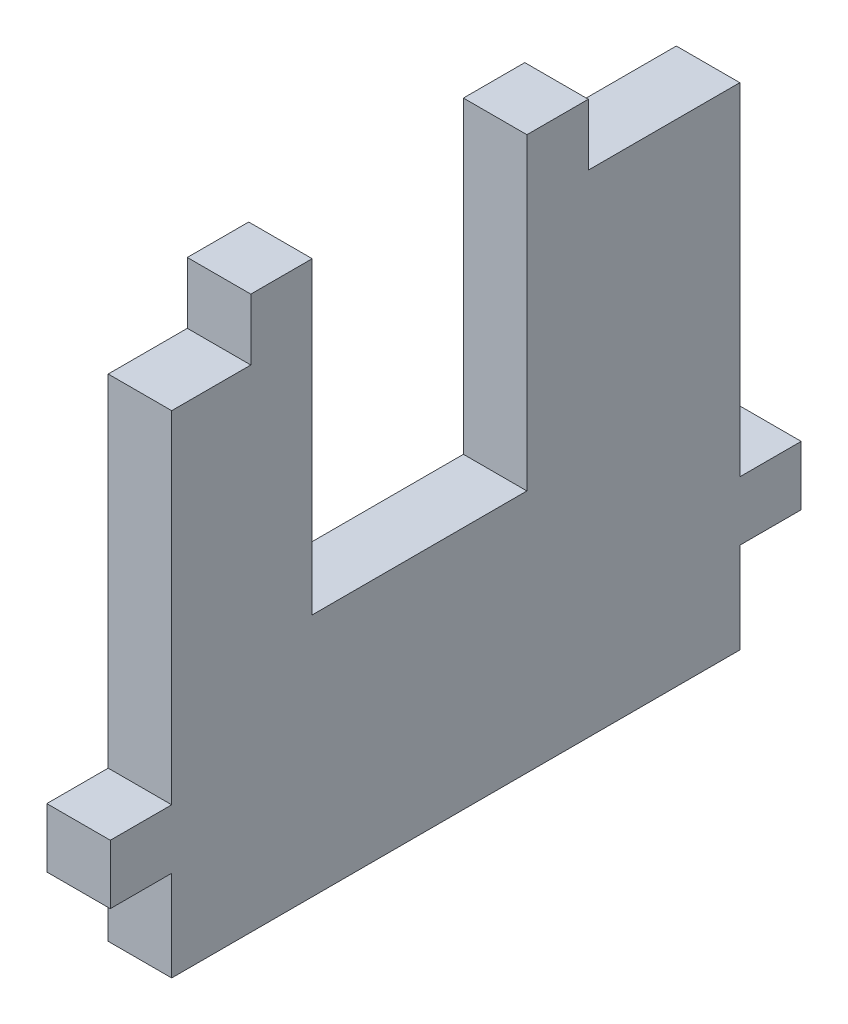
ISO-10303-21;
HEADER;
FILE_DESCRIPTION(('STEP AP214'),'2;1');
FILE_NAME('part.step','',(''),(''),'','','');
FILE_SCHEMA(('AUTOMOTIVE_DESIGN { 1 0 10303 214 1 1 1 1 }'));
ENDSEC;
DATA;
#1=APPLICATION_CONTEXT('core data for automotive mechanical design processes');
#2=APPLICATION_PROTOCOL_DEFINITION('international standard','automotive_design',2000,#1);
#3=PRODUCT_CONTEXT('',#1,'mechanical');
#4=PRODUCT('Part','Part','',(#3));
#5=PRODUCT_RELATED_PRODUCT_CATEGORY('part','',(#4));
#6=PRODUCT_DEFINITION_FORMATION('','',#4);
#7=PRODUCT_DEFINITION_CONTEXT('part definition',#1,'design');
#8=PRODUCT_DEFINITION('design','',#6,#7);
#9=PRODUCT_DEFINITION_SHAPE('','',#8);
#10=(LENGTH_UNIT() NAMED_UNIT(*) SI_UNIT(.MILLI.,.METRE.));
#11=(NAMED_UNIT(*) PLANE_ANGLE_UNIT() SI_UNIT($,.RADIAN.));
#12=(NAMED_UNIT(*) SI_UNIT($,.STERADIAN.) SOLID_ANGLE_UNIT());
#13=UNCERTAINTY_MEASURE_WITH_UNIT(LENGTH_MEASURE(1.E-05),#10,'distance_accuracy_value','');
#14=(GEOMETRIC_REPRESENTATION_CONTEXT(3) GLOBAL_UNCERTAINTY_ASSIGNED_CONTEXT((#13)) GLOBAL_UNIT_ASSIGNED_CONTEXT((#10,
#11,#12)) REPRESENTATION_CONTEXT('',''));
#15=CARTESIAN_POINT('',(0.,0.,0.));
#16=DIRECTION('',(0.,0.,1.));
#17=DIRECTION('',(1.,0.,0.));
#18=AXIS2_PLACEMENT_3D('',#15,#16,#17);
#19=CARTESIAN_POINT('',(-13.5209182106125,43.5041824122919,47.0580851754815));
#20=DIRECTION('',(0.,0.,1.));
#21=DIRECTION('',(1.,0.,0.));
#22=AXIS2_PLACEMENT_3D('',#19,#20,#21);
#23=PLANE('',#22);
#24=DIRECTION('',(1.,0.,0.));
#25=VECTOR('',#24,1.);
#26=CARTESIAN_POINT('',(-16.5209182106125,50.5903547962719,47.0580851754815));
#27=LINE('',#26,#25);
#28=CARTESIAN_POINT('',(-16.5209182106125,50.5903547962719,47.0580851754815));
#29=VERTEX_POINT('',#28);
#30=CARTESIAN_POINT('',(-13.5209182106125,50.5903547962719,47.0580851754815));
#31=VERTEX_POINT('',#30);
#32=EDGE_CURVE('E224',#29,#31,#27,.T.);
#33=ORIENTED_EDGE('',*,*,#32,.F.);
#34=DIRECTION('',(0.,1.,0.));
#35=VECTOR('',#34,1.);
#36=CARTESIAN_POINT('',(-16.5209182106125,43.5041824122919,47.0580851754815));
#37=LINE('',#36,#35);
#38=CARTESIAN_POINT('',(-16.5209182106125,66.7163547962719,47.0580851754815));
#39=VERTEX_POINT('',#38);
#40=EDGE_CURVE('E318',#29,#39,#37,.T.);
#41=ORIENTED_EDGE('',*,*,#40,.T.);
#42=DIRECTION('',(-1.,0.,0.));
#43=VECTOR('',#42,1.);
#44=CARTESIAN_POINT('',(-13.5209182106125,66.7163547962719,47.0580851754815));
#45=LINE('',#44,#43);
#46=CARTESIAN_POINT('',(-13.5209182106125,66.7163547962719,47.0580851754815));
#47=VERTEX_POINT('',#46);
#48=EDGE_CURVE('E302',#47,#39,#45,.T.);
#49=ORIENTED_EDGE('',*,*,#48,.F.);
#50=DIRECTION('',(0.,1.,0.));
#51=VECTOR('',#50,1.);
#52=CARTESIAN_POINT('',(-13.5209182106125,43.5041824122919,47.0580851754815));
#53=LINE('',#52,#51);
#54=EDGE_CURVE('E262',#31,#47,#53,.T.);
#55=ORIENTED_EDGE('',*,*,#54,.F.);
#56=EDGE_LOOP('',(#33,#41,#49,#55));
#57=FACE_BOUND('',#56,.T.);
#58=ADVANCED_FACE('F32',(#57),#23,.F.);
#59=CARTESIAN_POINT('',(-13.5209182106125,66.7163547962719,73.8980851754815));
#60=DIRECTION('',(0.,0.,-1.));
#61=DIRECTION('',(-1.,0.,0.));
#62=AXIS2_PLACEMENT_3D('',#59,#60,#61);
#63=PLANE('',#62);
#64=DIRECTION('',(1.,0.,0.));
#65=VECTOR('',#64,1.);
#66=CARTESIAN_POINT('',(-16.5209182106125,47.790354796272,73.8980851754815));
#67=LINE('',#66,#65);
#68=CARTESIAN_POINT('',(-16.5209182106125,47.790354796272,73.8980851754815));
#69=VERTEX_POINT('',#68);
#70=CARTESIAN_POINT('',(-13.5209182106125,47.790354796272,73.8980851754815));
#71=VERTEX_POINT('',#70);
#72=EDGE_CURVE('E335',#69,#71,#67,.T.);
#73=ORIENTED_EDGE('',*,*,#72,.F.);
#74=DIRECTION('',(0.,-1.,0.));
#75=VECTOR('',#74,1.);
#76=CARTESIAN_POINT('',(-16.5209182106125,66.7163547962719,73.8980851754815));
#77=LINE('',#76,#75);
#78=CARTESIAN_POINT('',(-16.5209182106125,43.5041824122919,73.8980851754815));
#79=VERTEX_POINT('',#78);
#80=EDGE_CURVE('E284',#69,#79,#77,.T.);
#81=ORIENTED_EDGE('',*,*,#80,.T.);
#82=DIRECTION('',(-1.,0.,0.));
#83=VECTOR('',#82,1.);
#84=CARTESIAN_POINT('',(-13.5209182106125,43.5041824122919,73.8980851754815));
#85=LINE('',#84,#83);
#86=CARTESIAN_POINT('',(-13.5209182106125,43.5041824122919,73.8980851754815));
#87=VERTEX_POINT('',#86);
#88=EDGE_CURVE('E41',#87,#79,#85,.T.);
#89=ORIENTED_EDGE('',*,*,#88,.F.);
#90=DIRECTION('',(0.,-1.,0.));
#91=VECTOR('',#90,1.);
#92=CARTESIAN_POINT('',(-13.5209182106125,66.7163547962719,73.8980851754815));
#93=LINE('',#92,#91);
#94=EDGE_CURVE('E348',#71,#87,#93,.T.);
#95=ORIENTED_EDGE('',*,*,#94,.F.);
#96=EDGE_LOOP('',(#73,#81,#89,#95));
#97=FACE_BOUND('',#96,.T.);
#98=ADVANCED_FACE('F366',(#97),#63,.F.);
#99=CARTESIAN_POINT('',(-13.5209182106125,66.7163547962719,73.8980851754815));
#100=DIRECTION('',(0.,-1.,0.));
#101=DIRECTION('',(1.,0.,0.));
#102=AXIS2_PLACEMENT_3D('',#99,#100,#101);
#103=PLANE('',#102);
#104=DIRECTION('',(0.,0.,1.));
#105=VECTOR('',#104,1.);
#106=CARTESIAN_POINT('',(-13.5209182106125,66.7163547962719,73.8980851754815));
#107=LINE('',#106,#105);
#108=CARTESIAN_POINT('',(-13.5209182106125,66.7163547962719,70.1600851754816));
#109=VERTEX_POINT('',#108);
#110=CARTESIAN_POINT('',(-13.5209182106125,66.7163547962719,73.8980851754815));
#111=VERTEX_POINT('',#110);
#112=EDGE_CURVE('E311',#109,#111,#107,.T.);
#113=ORIENTED_EDGE('',*,*,#112,.F.);
#114=DIRECTION('',(1.,0.,0.));
#115=VECTOR('',#114,1.);
#116=CARTESIAN_POINT('',(-16.5209182106125,66.7163547962719,70.1600851754816));
#117=LINE('',#116,#115);
#118=CARTESIAN_POINT('',(-16.5209182106125,66.7163547962719,70.1600851754816));
#119=VERTEX_POINT('',#118);
#120=EDGE_CURVE('E213',#119,#109,#117,.T.);
#121=ORIENTED_EDGE('',*,*,#120,.F.);
#122=DIRECTION('',(0.,0.,1.));
#123=VECTOR('',#122,1.);
#124=CARTESIAN_POINT('',(-16.5209182106125,66.7163547962719,73.8980851754815));
#125=LINE('',#124,#123);
#126=CARTESIAN_POINT('',(-16.5209182106125,66.7163547962719,73.8980851754815));
#127=VERTEX_POINT('',#126);
#128=EDGE_CURVE('E282',#119,#127,#125,.T.);
#129=ORIENTED_EDGE('',*,*,#128,.T.);
#130=DIRECTION('',(-1.,0.,0.));
#131=VECTOR('',#130,1.);
#132=CARTESIAN_POINT('',(-13.5209182106125,66.7163547962719,73.8980851754815));
#133=LINE('',#132,#131);
#134=EDGE_CURVE('E11',#111,#127,#133,.T.);
#135=ORIENTED_EDGE('',*,*,#134,.F.);
#136=EDGE_LOOP('',(#113,#121,#129,#135));
#137=FACE_BOUND('',#136,.T.);
#138=ADVANCED_FACE('F34',(#137),#103,.F.);
#139=CARTESIAN_POINT('',(-16.5209182106125,50.5903547962719,73.8980851754815));
#140=VERTEX_POINT('',#139);
#141=EDGE_CURVE('E294',#127,#140,#77,.T.);
#142=ORIENTED_EDGE('',*,*,#141,.T.);
#143=DIRECTION('',(1.,0.,0.));
#144=VECTOR('',#143,1.);
#145=CARTESIAN_POINT('',(-16.5209182106125,50.5903547962719,73.8980851754815));
#146=LINE('',#145,#144);
#147=CARTESIAN_POINT('',(-13.5209182106125,50.5903547962719,73.8980851754815));
#148=VERTEX_POINT('',#147);
#149=EDGE_CURVE('E285',#140,#148,#146,.T.);
#150=ORIENTED_EDGE('',*,*,#149,.T.);
#151=EDGE_CURVE('E353',#111,#148,#93,.T.);
#152=ORIENTED_EDGE('',*,*,#151,.F.);
#153=ORIENTED_EDGE('',*,*,#134,.T.);
#154=EDGE_LOOP('',(#142,#150,#152,#153));
#155=FACE_BOUND('',#154,.T.);
#156=ADVANCED_FACE('F404',(#155),#63,.F.);
#157=CARTESIAN_POINT('',(-13.5209182106125,43.5041824122919,47.0580851754815));
#158=DIRECTION('',(0.,1.,0.));
#159=DIRECTION('',(-1.,0.,0.));
#160=AXIS2_PLACEMENT_3D('',#157,#158,#159);
#161=PLANE('',#160);
#162=DIRECTION('',(0.,0.,-1.));
#163=VECTOR('',#162,1.);
#164=CARTESIAN_POINT('',(-16.5209182106125,43.5041824122919,47.0580851754815));
#165=LINE('',#164,#163);
#166=CARTESIAN_POINT('',(-16.5209182106125,43.5041824122919,47.0580851754815));
#167=VERTEX_POINT('',#166);
#168=EDGE_CURVE('E288',#79,#167,#165,.T.);
#169=ORIENTED_EDGE('',*,*,#168,.T.);
#170=DIRECTION('',(-1.,0.,0.));
#171=VECTOR('',#170,1.);
#172=CARTESIAN_POINT('',(-13.5209182106125,43.5041824122919,47.0580851754815));
#173=LINE('',#172,#171);
#174=CARTESIAN_POINT('',(-13.5209182106125,43.5041824122919,47.0580851754815));
#175=VERTEX_POINT('',#174);
#176=EDGE_CURVE('E299',#175,#167,#173,.T.);
#177=ORIENTED_EDGE('',*,*,#176,.F.);
#178=DIRECTION('',(0.,0.,-1.));
#179=VECTOR('',#178,1.);
#180=CARTESIAN_POINT('',(-13.5209182106125,43.5041824122919,47.0580851754815));
#181=LINE('',#180,#179);
#182=EDGE_CURVE('E266',#87,#175,#181,.T.);
#183=ORIENTED_EDGE('',*,*,#182,.F.);
#184=ORIENTED_EDGE('',*,*,#88,.T.);
#185=EDGE_LOOP('',(#169,#177,#183,#184));
#186=FACE_BOUND('',#185,.T.);
#187=ADVANCED_FACE('F370',(#186),#161,.F.);
#188=CARTESIAN_POINT('',(-16.5209182106125,47.790354796272,47.0580851754815));
#189=VERTEX_POINT('',#188);
#190=EDGE_CURVE('E315',#167,#189,#37,.T.);
#191=ORIENTED_EDGE('',*,*,#190,.T.);
#192=DIRECTION('',(1.,0.,0.));
#193=VECTOR('',#192,1.);
#194=CARTESIAN_POINT('',(-16.5209182106125,47.790354796272,47.0580851754815));
#195=LINE('',#194,#193);
#196=CARTESIAN_POINT('',(-13.5209182106125,47.790354796272,47.0580851754815));
#197=VERTEX_POINT('',#196);
#198=EDGE_CURVE('E236',#189,#197,#195,.T.);
#199=ORIENTED_EDGE('',*,*,#198,.T.);
#200=EDGE_CURVE('E265',#175,#197,#53,.T.);
#201=ORIENTED_EDGE('',*,*,#200,.F.);
#202=ORIENTED_EDGE('',*,*,#176,.T.);
#203=EDGE_LOOP('',(#191,#199,#201,#202));
#204=FACE_BOUND('',#203,.T.);
#205=ADVANCED_FACE('F374',(#204),#23,.F.);
#206=CARTESIAN_POINT('',(-13.5209182106125,66.7163547962719,57.1160851754815));
#207=DIRECTION('',(0.,-1.,0.));
#208=DIRECTION('',(1.,0.,0.));
#209=AXIS2_PLACEMENT_3D('',#206,#207,#208);
#210=PLANE('',#209);
#211=DIRECTION('',(0.,0.,1.));
#212=VECTOR('',#211,1.);
#213=CARTESIAN_POINT('',(-16.5209182106125,66.7163547962719,57.1160851754815));
#214=LINE('',#213,#212);
#215=CARTESIAN_POINT('',(-16.5209182106125,66.7163547962719,54.2160851754815));
#216=VERTEX_POINT('',#215);
#217=EDGE_CURVE('E54',#39,#216,#214,.T.);
#218=ORIENTED_EDGE('',*,*,#217,.T.);
#219=DIRECTION('',(1.,0.,0.));
#220=VECTOR('',#219,1.);
#221=CARTESIAN_POINT('',(-16.5209182106125,66.716354796272,54.2160851754815));
#222=LINE('',#221,#220);
#223=CARTESIAN_POINT('',(-13.5209182106125,66.7163547962719,54.2160851754815));
#224=VERTEX_POINT('',#223);
#225=EDGE_CURVE('E49',#216,#224,#222,.T.);
#226=ORIENTED_EDGE('',*,*,#225,.T.);
#227=DIRECTION('',(0.,0.,1.));
#228=VECTOR('',#227,1.);
#229=CARTESIAN_POINT('',(-13.5209182106125,66.7163547962719,57.1160851754815));
#230=LINE('',#229,#228);
#231=EDGE_CURVE('E272',#47,#224,#230,.T.);
#232=ORIENTED_EDGE('',*,*,#231,.F.);
#233=ORIENTED_EDGE('',*,*,#48,.T.);
#234=EDGE_LOOP('',(#218,#226,#232,#233));
#235=FACE_BOUND('',#234,.T.);
#236=ADVANCED_FACE('F388',(#235),#210,.F.);
#237=CARTESIAN_POINT('',(-13.5209182106125,55.0403547962719,57.1160851754815));
#238=DIRECTION('',(0.,0.,-1.));
#239=DIRECTION('',(-1.,0.,0.));
#240=AXIS2_PLACEMENT_3D('',#237,#238,#239);
#241=PLANE('',#240);
#242=DIRECTION('',(0.,-1.,0.));
#243=VECTOR('',#242,1.);
#244=CARTESIAN_POINT('',(-16.5209182106125,55.0403547962719,57.1160851754815));
#245=LINE('',#244,#243);
#246=CARTESIAN_POINT('',(-16.5209182106125,69.616354796272,57.1160851754815));
#247=VERTEX_POINT('',#246);
#248=CARTESIAN_POINT('',(-16.5209182106125,55.0403547962719,57.1160851754815));
#249=VERTEX_POINT('',#248);
#250=EDGE_CURVE('E191',#247,#249,#245,.T.);
#251=ORIENTED_EDGE('',*,*,#250,.T.);
#252=DIRECTION('',(-1.,0.,0.));
#253=VECTOR('',#252,1.);
#254=CARTESIAN_POINT('',(-13.5209182106125,55.0403547962719,57.1160851754815));
#255=LINE('',#254,#253);
#256=CARTESIAN_POINT('',(-13.5209182106125,55.0403547962719,57.1160851754815));
#257=VERTEX_POINT('',#256);
#258=EDGE_CURVE('E304',#257,#249,#255,.T.);
#259=ORIENTED_EDGE('',*,*,#258,.F.);
#260=DIRECTION('',(0.,-1.,0.));
#261=VECTOR('',#260,1.);
#262=CARTESIAN_POINT('',(-13.5209182106125,55.0403547962719,57.1160851754815));
#263=LINE('',#262,#261);
#264=CARTESIAN_POINT('',(-13.5209182106125,69.616354796272,57.1160851754815));
#265=VERTEX_POINT('',#264);
#266=EDGE_CURVE('E275',#265,#257,#263,.T.);
#267=ORIENTED_EDGE('',*,*,#266,.F.);
#268=DIRECTION('',(1.,0.,0.));
#269=VECTOR('',#268,1.);
#270=CARTESIAN_POINT('',(-16.5209182106125,69.616354796272,57.1160851754815));
#271=LINE('',#270,#269);
#272=EDGE_CURVE('E182',#247,#265,#271,.T.);
#273=ORIENTED_EDGE('',*,*,#272,.F.);
#274=EDGE_LOOP('',(#251,#259,#267,#273));
#275=FACE_BOUND('',#274,.T.);
#276=ADVANCED_FACE('F390',(#275),#241,.F.);
#277=CARTESIAN_POINT('',(-13.5209182106125,55.0403547962719,67.2600851754816));
#278=DIRECTION('',(0.,-1.,0.));
#279=DIRECTION('',(1.,0.,0.));
#280=AXIS2_PLACEMENT_3D('',#277,#278,#279);
#281=PLANE('',#280);
#282=DIRECTION('',(0.,0.,1.));
#283=VECTOR('',#282,1.);
#284=CARTESIAN_POINT('',(-16.5209182106125,55.0403547962719,67.2600851754816));
#285=LINE('',#284,#283);
#286=CARTESIAN_POINT('',(-16.5209182106125,55.0403547962719,67.2600851754816));
#287=VERTEX_POINT('',#286);
#288=EDGE_CURVE('E312',#249,#287,#285,.T.);
#289=ORIENTED_EDGE('',*,*,#288,.T.);
#290=DIRECTION('',(-1.,0.,0.));
#291=VECTOR('',#290,1.);
#292=CARTESIAN_POINT('',(-13.5209182106125,55.0403547962719,67.2600851754816));
#293=LINE('',#292,#291);
#294=CARTESIAN_POINT('',(-13.5209182106125,55.0403547962719,67.2600851754816));
#295=VERTEX_POINT('',#294);
#296=EDGE_CURVE('E281',#295,#287,#293,.T.);
#297=ORIENTED_EDGE('',*,*,#296,.F.);
#298=DIRECTION('',(0.,0.,1.));
#299=VECTOR('',#298,1.);
#300=CARTESIAN_POINT('',(-13.5209182106125,55.0403547962719,67.2600851754816));
#301=LINE('',#300,#299);
#302=EDGE_CURVE('E277',#257,#295,#301,.T.);
#303=ORIENTED_EDGE('',*,*,#302,.F.);
#304=ORIENTED_EDGE('',*,*,#258,.T.);
#305=EDGE_LOOP('',(#289,#297,#303,#304));
#306=FACE_BOUND('',#305,.T.);
#307=ADVANCED_FACE('F396',(#306),#281,.F.);
#308=CARTESIAN_POINT('',(-13.5209182106125,66.7163547962719,67.2600851754816));
#309=DIRECTION('',(0.,0.,1.));
#310=DIRECTION('',(1.,0.,0.));
#311=AXIS2_PLACEMENT_3D('',#308,#309,#310);
#312=PLANE('',#311);
#313=DIRECTION('',(0.,1.,0.));
#314=VECTOR('',#313,1.);
#315=CARTESIAN_POINT('',(-16.5209182106125,66.7163547962719,67.2600851754816));
#316=LINE('',#315,#314);
#317=CARTESIAN_POINT('',(-16.5209182106125,69.616354796272,67.2600851754816));
#318=VERTEX_POINT('',#317);
#319=EDGE_CURVE('E309',#287,#318,#316,.T.);
#320=ORIENTED_EDGE('',*,*,#319,.T.);
#321=DIRECTION('',(1.,0.,0.));
#322=VECTOR('',#321,1.);
#323=CARTESIAN_POINT('',(-16.5209182106125,69.616354796272,67.2600851754816));
#324=LINE('',#323,#322);
#325=CARTESIAN_POINT('',(-13.5209182106125,69.616354796272,67.2600851754816));
#326=VERTEX_POINT('',#325);
#327=EDGE_CURVE('E208',#318,#326,#324,.T.);
#328=ORIENTED_EDGE('',*,*,#327,.T.);
#329=DIRECTION('',(0.,1.,0.));
#330=VECTOR('',#329,1.);
#331=CARTESIAN_POINT('',(-13.5209182106125,66.7163547962719,67.2600851754816));
#332=LINE('',#331,#330);
#333=EDGE_CURVE('E279',#295,#326,#332,.T.);
#334=ORIENTED_EDGE('',*,*,#333,.F.);
#335=ORIENTED_EDGE('',*,*,#296,.T.);
#336=EDGE_LOOP('',(#320,#328,#334,#335));
#337=FACE_BOUND('',#336,.T.);
#338=ADVANCED_FACE('F446',(#337),#312,.F.);
#339=CARTESIAN_POINT('',(-13.5209182106126,0.,0.));
#340=DIRECTION('',(-1.,0.,0.));
#341=DIRECTION('',(0.,0.,1.));
#342=AXIS2_PLACEMENT_3D('',#339,#340,#341);
#343=PLANE('',#342);
#344=ORIENTED_EDGE('',*,*,#333,.T.);
#345=DIRECTION('',(0.,0.,1.));
#346=VECTOR('',#345,1.);
#347=CARTESIAN_POINT('',(-13.5209182106125,69.616354796272,67.2600851754816));
#348=LINE('',#347,#346);
#349=CARTESIAN_POINT('',(-13.5209182106125,69.616354796272,70.1600851754816));
#350=VERTEX_POINT('',#349);
#351=EDGE_CURVE('E199',#326,#350,#348,.T.);
#352=ORIENTED_EDGE('',*,*,#351,.T.);
#353=DIRECTION('',(0.,-1.,0.));
#354=VECTOR('',#353,1.);
#355=CARTESIAN_POINT('',(-13.5209182106125,66.7163547962719,70.1600851754816));
#356=LINE('',#355,#354);
#357=EDGE_CURVE('E205',#350,#109,#356,.T.);
#358=ORIENTED_EDGE('',*,*,#357,.T.);
#359=ORIENTED_EDGE('',*,*,#112,.T.);
#360=ORIENTED_EDGE('',*,*,#151,.T.);
#361=DIRECTION('',(0.,0.,1.));
#362=VECTOR('',#361,1.);
#363=CARTESIAN_POINT('',(-13.5209182106125,50.5903547962719,73.8980851754815));
#364=LINE('',#363,#362);
#365=CARTESIAN_POINT('',(-13.5209182106125,50.5903547962719,76.7980851754815));
#366=VERTEX_POINT('',#365);
#367=EDGE_CURVE('E233',#148,#366,#364,.T.);
#368=ORIENTED_EDGE('',*,*,#367,.T.);
#369=DIRECTION('',(0.,-1.,0.));
#370=VECTOR('',#369,1.);
#371=CARTESIAN_POINT('',(-13.5209182106125,50.5903547962719,76.7980851754815));
#372=LINE('',#371,#370);
#373=CARTESIAN_POINT('',(-13.5209182106125,47.790354796272,76.7980851754815));
#374=VERTEX_POINT('',#373);
#375=EDGE_CURVE('E328',#366,#374,#372,.T.);
#376=ORIENTED_EDGE('',*,*,#375,.T.);
#377=DIRECTION('',(0.,0.,-1.));
#378=VECTOR('',#377,1.);
#379=CARTESIAN_POINT('',(-13.5209182106125,47.790354796272,76.7980851754815));
#380=LINE('',#379,#378);
#381=EDGE_CURVE('E324',#374,#71,#380,.T.);
#382=ORIENTED_EDGE('',*,*,#381,.T.);
#383=ORIENTED_EDGE('',*,*,#94,.T.);
#384=ORIENTED_EDGE('',*,*,#182,.T.);
#385=ORIENTED_EDGE('',*,*,#200,.T.);
#386=DIRECTION('',(0.,0.,-1.));
#387=VECTOR('',#386,1.);
#388=CARTESIAN_POINT('',(-13.5209182106125,47.790354796272,44.1580851754815));
#389=LINE('',#388,#387);
#390=CARTESIAN_POINT('',(-13.5209182106125,47.790354796272,44.1580851754815));
#391=VERTEX_POINT('',#390);
#392=EDGE_CURVE('E230',#197,#391,#389,.T.);
#393=ORIENTED_EDGE('',*,*,#392,.T.);
#394=DIRECTION('',(0.,1.,0.));
#395=VECTOR('',#394,1.);
#396=CARTESIAN_POINT('',(-13.5209182106125,50.5903547962719,44.1580851754815));
#397=LINE('',#396,#395);
#398=CARTESIAN_POINT('',(-13.5209182106125,50.5903547962719,44.1580851754815));
#399=VERTEX_POINT('',#398);
#400=EDGE_CURVE('E226',#391,#399,#397,.T.);
#401=ORIENTED_EDGE('',*,*,#400,.T.);
#402=DIRECTION('',(0.,0.,1.));
#403=VECTOR('',#402,1.);
#404=CARTESIAN_POINT('',(-13.5209182106125,50.5903547962719,47.0580851754815));
#405=LINE('',#404,#403);
#406=EDGE_CURVE('E216',#399,#31,#405,.T.);
#407=ORIENTED_EDGE('',*,*,#406,.T.);
#408=ORIENTED_EDGE('',*,*,#54,.T.);
#409=ORIENTED_EDGE('',*,*,#231,.T.);
#410=DIRECTION('',(0.,1.,0.));
#411=VECTOR('',#410,1.);
#412=CARTESIAN_POINT('',(-13.5209182106125,66.716354796272,54.2160851754815));
#413=LINE('',#412,#411);
#414=CARTESIAN_POINT('',(-13.5209182106125,69.616354796272,54.2160851754815));
#415=VERTEX_POINT('',#414);
#416=EDGE_CURVE('E196',#224,#415,#413,.T.);
#417=ORIENTED_EDGE('',*,*,#416,.T.);
#418=DIRECTION('',(0.,0.,1.));
#419=VECTOR('',#418,1.);
#420=CARTESIAN_POINT('',(-13.5209182106125,69.616354796272,57.1160851754815));
#421=LINE('',#420,#419);
#422=EDGE_CURVE('E178',#415,#265,#421,.T.);
#423=ORIENTED_EDGE('',*,*,#422,.T.);
#424=ORIENTED_EDGE('',*,*,#266,.T.);
#425=ORIENTED_EDGE('',*,*,#302,.T.);
#426=EDGE_LOOP('',(#344,#352,#358,#359,#360,#368,#376,#382,#383,#384,#385,#393,#401,#407,#408,
#409,#417,#423,#424,#425));
#427=FACE_BOUND('',#426,.T.);
#428=ADVANCED_FACE('F359',(#427),#343,.F.);
#429=CARTESIAN_POINT('',(-16.5209182106126,0.,0.));
#430=DIRECTION('',(-1.,0.,0.));
#431=DIRECTION('',(0.,0.,1.));
#432=AXIS2_PLACEMENT_3D('',#429,#430,#431);
#433=PLANE('',#432);
#434=ORIENTED_EDGE('',*,*,#128,.F.);
#435=DIRECTION('',(0.,-1.,0.));
#436=VECTOR('',#435,1.);
#437=CARTESIAN_POINT('',(-16.5209182106125,66.7163547962719,70.1600851754816));
#438=LINE('',#437,#436);
#439=CARTESIAN_POINT('',(-16.5209182106125,69.616354796272,70.1600851754816));
#440=VERTEX_POINT('',#439);
#441=EDGE_CURVE('E204',#440,#119,#438,.T.);
#442=ORIENTED_EDGE('',*,*,#441,.F.);
#443=DIRECTION('',(0.,0.,1.));
#444=VECTOR('',#443,1.);
#445=CARTESIAN_POINT('',(-16.5209182106125,69.616354796272,67.2600851754816));
#446=LINE('',#445,#444);
#447=EDGE_CURVE('E201',#318,#440,#446,.T.);
#448=ORIENTED_EDGE('',*,*,#447,.F.);
#449=ORIENTED_EDGE('',*,*,#319,.F.);
#450=ORIENTED_EDGE('',*,*,#288,.F.);
#451=ORIENTED_EDGE('',*,*,#250,.F.);
#452=DIRECTION('',(0.,0.,1.));
#453=VECTOR('',#452,1.);
#454=CARTESIAN_POINT('',(-16.5209182106125,69.616354796272,57.1160851754815));
#455=LINE('',#454,#453);
#456=CARTESIAN_POINT('',(-16.5209182106125,69.616354796272,54.2160851754815));
#457=VERTEX_POINT('',#456);
#458=EDGE_CURVE('E176',#457,#247,#455,.T.);
#459=ORIENTED_EDGE('',*,*,#458,.F.);
#460=DIRECTION('',(0.,1.,0.));
#461=VECTOR('',#460,1.);
#462=CARTESIAN_POINT('',(-16.5209182106125,66.716354796272,54.2160851754815));
#463=LINE('',#462,#461);
#464=EDGE_CURVE('E185',#216,#457,#463,.T.);
#465=ORIENTED_EDGE('',*,*,#464,.F.);
#466=ORIENTED_EDGE('',*,*,#217,.F.);
#467=ORIENTED_EDGE('',*,*,#40,.F.);
#468=DIRECTION('',(0.,0.,1.));
#469=VECTOR('',#468,1.);
#470=CARTESIAN_POINT('',(-16.5209182106125,50.5903547962719,47.0580851754815));
#471=LINE('',#470,#469);
#472=CARTESIAN_POINT('',(-16.5209182106125,50.5903547962719,44.1580851754815));
#473=VERTEX_POINT('',#472);
#474=EDGE_CURVE('E229',#473,#29,#471,.T.);
#475=ORIENTED_EDGE('',*,*,#474,.F.);
#476=DIRECTION('',(0.,1.,0.));
#477=VECTOR('',#476,1.);
#478=CARTESIAN_POINT('',(-16.5209182106125,50.5903547962719,44.1580851754815));
#479=LINE('',#478,#477);
#480=CARTESIAN_POINT('',(-16.5209182106125,47.790354796272,44.1580851754815));
#481=VERTEX_POINT('',#480);
#482=EDGE_CURVE('E221',#481,#473,#479,.T.);
#483=ORIENTED_EDGE('',*,*,#482,.F.);
#484=DIRECTION('',(0.,0.,-1.));
#485=VECTOR('',#484,1.);
#486=CARTESIAN_POINT('',(-16.5209182106125,47.790354796272,44.1580851754815));
#487=LINE('',#486,#485);
#488=EDGE_CURVE('E225',#189,#481,#487,.T.);
#489=ORIENTED_EDGE('',*,*,#488,.F.);
#490=ORIENTED_EDGE('',*,*,#190,.F.);
#491=ORIENTED_EDGE('',*,*,#168,.F.);
#492=ORIENTED_EDGE('',*,*,#80,.F.);
#493=DIRECTION('',(0.,0.,-1.));
#494=VECTOR('',#493,1.);
#495=CARTESIAN_POINT('',(-16.5209182106125,47.790354796272,76.7980851754815));
#496=LINE('',#495,#494);
#497=CARTESIAN_POINT('',(-16.5209182106125,47.790354796272,76.7980851754815));
#498=VERTEX_POINT('',#497);
#499=EDGE_CURVE('E331',#498,#69,#496,.T.);
#500=ORIENTED_EDGE('',*,*,#499,.F.);
#501=DIRECTION('',(0.,-1.,0.));
#502=VECTOR('',#501,1.);
#503=CARTESIAN_POINT('',(-16.5209182106125,50.5903547962719,76.7980851754815));
#504=LINE('',#503,#502);
#505=CARTESIAN_POINT('',(-16.5209182106125,50.5903547962719,76.7980851754815));
#506=VERTEX_POINT('',#505);
#507=EDGE_CURVE('E334',#506,#498,#504,.T.);
#508=ORIENTED_EDGE('',*,*,#507,.F.);
#509=DIRECTION('',(0.,0.,1.));
#510=VECTOR('',#509,1.);
#511=CARTESIAN_POINT('',(-16.5209182106125,50.5903547962719,73.8980851754815));
#512=LINE('',#511,#510);
#513=EDGE_CURVE('E327',#140,#506,#512,.T.);
#514=ORIENTED_EDGE('',*,*,#513,.F.);
#515=ORIENTED_EDGE('',*,*,#141,.F.);
#516=EDGE_LOOP('',(#434,#442,#448,#449,#450,#451,#459,#465,#466,#467,#475,#483,#489,#490,#491,
#492,#500,#508,#514,#515));
#517=FACE_BOUND('',#516,.T.);
#518=ADVANCED_FACE('F189',(#517),#433,.T.);
#519=CARTESIAN_POINT('',(-16.5209182106125,50.5903547962719,73.8980851754815));
#520=DIRECTION('',(0.,1.,0.));
#521=DIRECTION('',(-1.,0.,0.));
#522=AXIS2_PLACEMENT_3D('',#519,#520,#521);
#523=PLANE('',#522);
#524=ORIENTED_EDGE('',*,*,#367,.F.);
#525=ORIENTED_EDGE('',*,*,#149,.F.);
#526=ORIENTED_EDGE('',*,*,#513,.T.);
#527=DIRECTION('',(1.,0.,0.));
#528=VECTOR('',#527,1.);
#529=CARTESIAN_POINT('',(-16.5209182106125,50.5903547962719,76.7980851754815));
#530=LINE('',#529,#528);
#531=EDGE_CURVE('E333',#506,#366,#530,.T.);
#532=ORIENTED_EDGE('',*,*,#531,.T.);
#533=EDGE_LOOP('',(#524,#525,#526,#532));
#534=FACE_BOUND('',#533,.T.);
#535=ADVANCED_FACE('F433',(#534),#523,.T.);
#536=CARTESIAN_POINT('',(-16.5209182106125,47.790354796272,76.7980851754815));
#537=DIRECTION('',(0.,-1.,0.));
#538=DIRECTION('',(1.,0.,0.));
#539=AXIS2_PLACEMENT_3D('',#536,#537,#538);
#540=PLANE('',#539);
#541=ORIENTED_EDGE('',*,*,#381,.F.);
#542=DIRECTION('',(1.,0.,0.));
#543=VECTOR('',#542,1.);
#544=CARTESIAN_POINT('',(-16.5209182106125,47.790354796272,76.7980851754815));
#545=LINE('',#544,#543);
#546=EDGE_CURVE('E338',#498,#374,#545,.T.);
#547=ORIENTED_EDGE('',*,*,#546,.F.);
#548=ORIENTED_EDGE('',*,*,#499,.T.);
#549=ORIENTED_EDGE('',*,*,#72,.T.);
#550=EDGE_LOOP('',(#541,#547,#548,#549));
#551=FACE_BOUND('',#550,.T.);
#552=ADVANCED_FACE('F431',(#551),#540,.T.);
#553=CARTESIAN_POINT('',(-16.5209182106125,50.5903547962719,76.7980851754815));
#554=DIRECTION('',(0.,0.,1.));
#555=DIRECTION('',(1.,0.,0.));
#556=AXIS2_PLACEMENT_3D('',#553,#554,#555);
#557=PLANE('',#556);
#558=ORIENTED_EDGE('',*,*,#375,.F.);
#559=ORIENTED_EDGE('',*,*,#531,.F.);
#560=ORIENTED_EDGE('',*,*,#507,.T.);
#561=ORIENTED_EDGE('',*,*,#546,.T.);
#562=EDGE_LOOP('',(#558,#559,#560,#561));
#563=FACE_BOUND('',#562,.T.);
#564=ADVANCED_FACE('F429',(#563),#557,.T.);
#565=CARTESIAN_POINT('',(-16.5209182106125,50.5903547962719,47.0580851754815));
#566=DIRECTION('',(0.,1.,0.));
#567=DIRECTION('',(-1.,0.,0.));
#568=AXIS2_PLACEMENT_3D('',#565,#566,#567);
#569=PLANE('',#568);
#570=ORIENTED_EDGE('',*,*,#406,.F.);
#571=DIRECTION('',(1.,0.,0.));
#572=VECTOR('',#571,1.);
#573=CARTESIAN_POINT('',(-16.5209182106125,50.5903547962719,44.1580851754815));
#574=LINE('',#573,#572);
#575=EDGE_CURVE('E231',#473,#399,#574,.T.);
#576=ORIENTED_EDGE('',*,*,#575,.F.);
#577=ORIENTED_EDGE('',*,*,#474,.T.);
#578=ORIENTED_EDGE('',*,*,#32,.T.);
#579=EDGE_LOOP('',(#570,#576,#577,#578));
#580=FACE_BOUND('',#579,.T.);
#581=ADVANCED_FACE('F384',(#580),#569,.T.);
#582=CARTESIAN_POINT('',(-16.5209182106125,50.5903547962719,44.1580851754815));
#583=DIRECTION('',(0.,0.,-1.));
#584=DIRECTION('',(-1.,0.,0.));
#585=AXIS2_PLACEMENT_3D('',#582,#583,#584);
#586=PLANE('',#585);
#587=ORIENTED_EDGE('',*,*,#400,.F.);
#588=DIRECTION('',(1.,0.,0.));
#589=VECTOR('',#588,1.);
#590=CARTESIAN_POINT('',(-16.5209182106125,47.790354796272,44.1580851754815));
#591=LINE('',#590,#589);
#592=EDGE_CURVE('E234',#481,#391,#591,.T.);
#593=ORIENTED_EDGE('',*,*,#592,.F.);
#594=ORIENTED_EDGE('',*,*,#482,.T.);
#595=ORIENTED_EDGE('',*,*,#575,.T.);
#596=EDGE_LOOP('',(#587,#593,#594,#595));
#597=FACE_BOUND('',#596,.T.);
#598=ADVANCED_FACE('F382',(#597),#586,.T.);
#599=CARTESIAN_POINT('',(-16.5209182106125,47.790354796272,44.1580851754815));
#600=DIRECTION('',(0.,-1.,0.));
#601=DIRECTION('',(1.,0.,0.));
#602=AXIS2_PLACEMENT_3D('',#599,#600,#601);
#603=PLANE('',#602);
#604=ORIENTED_EDGE('',*,*,#392,.F.);
#605=ORIENTED_EDGE('',*,*,#198,.F.);
#606=ORIENTED_EDGE('',*,*,#488,.T.);
#607=ORIENTED_EDGE('',*,*,#592,.T.);
#608=EDGE_LOOP('',(#604,#605,#606,#607));
#609=FACE_BOUND('',#608,.T.);
#610=ADVANCED_FACE('F377',(#609),#603,.T.);
#611=CARTESIAN_POINT('',(-16.5209182106125,66.7163547962719,70.1600851754816));
#612=DIRECTION('',(0.,0.,1.));
#613=DIRECTION('',(1.,0.,0.));
#614=AXIS2_PLACEMENT_3D('',#611,#612,#613);
#615=PLANE('',#614);
#616=ORIENTED_EDGE('',*,*,#357,.F.);
#617=DIRECTION('',(1.,0.,0.));
#618=VECTOR('',#617,1.);
#619=CARTESIAN_POINT('',(-16.5209182106125,69.616354796272,70.1600851754816));
#620=LINE('',#619,#618);
#621=EDGE_CURVE('E217',#440,#350,#620,.T.);
#622=ORIENTED_EDGE('',*,*,#621,.F.);
#623=ORIENTED_EDGE('',*,*,#441,.T.);
#624=ORIENTED_EDGE('',*,*,#120,.T.);
#625=EDGE_LOOP('',(#616,#622,#623,#624));
#626=FACE_BOUND('',#625,.T.);
#627=ADVANCED_FACE('F468',(#626),#615,.T.);
#628=CARTESIAN_POINT('',(-16.5209182106125,69.616354796272,67.2600851754816));
#629=DIRECTION('',(0.,1.,0.));
#630=DIRECTION('',(-1.,0.,0.));
#631=AXIS2_PLACEMENT_3D('',#628,#629,#630);
#632=PLANE('',#631);
#633=ORIENTED_EDGE('',*,*,#351,.F.);
#634=ORIENTED_EDGE('',*,*,#327,.F.);
#635=ORIENTED_EDGE('',*,*,#447,.T.);
#636=ORIENTED_EDGE('',*,*,#621,.T.);
#637=EDGE_LOOP('',(#633,#634,#635,#636));
#638=FACE_BOUND('',#637,.T.);
#639=ADVANCED_FACE('F465',(#638),#632,.T.);
#640=CARTESIAN_POINT('',(-16.5209182106125,69.616354796272,57.1160851754815));
#641=DIRECTION('',(0.,1.,0.));
#642=DIRECTION('',(-1.,0.,0.));
#643=AXIS2_PLACEMENT_3D('',#640,#641,#642);
#644=PLANE('',#643);
#645=ORIENTED_EDGE('',*,*,#422,.F.);
#646=DIRECTION('',(1.,0.,0.));
#647=VECTOR('',#646,1.);
#648=CARTESIAN_POINT('',(-16.5209182106125,69.616354796272,54.2160851754815));
#649=LINE('',#648,#647);
#650=EDGE_CURVE('E171',#457,#415,#649,.T.);
#651=ORIENTED_EDGE('',*,*,#650,.F.);
#652=ORIENTED_EDGE('',*,*,#458,.T.);
#653=ORIENTED_EDGE('',*,*,#272,.T.);
#654=EDGE_LOOP('',(#645,#651,#652,#653));
#655=FACE_BOUND('',#654,.T.);
#656=ADVANCED_FACE('F173',(#655),#644,.T.);
#657=CARTESIAN_POINT('',(-16.5209182106125,66.716354796272,54.2160851754815));
#658=DIRECTION('',(0.,0.,-1.));
#659=DIRECTION('',(-1.,0.,0.));
#660=AXIS2_PLACEMENT_3D('',#657,#658,#659);
#661=PLANE('',#660);
#662=ORIENTED_EDGE('',*,*,#416,.F.);
#663=ORIENTED_EDGE('',*,*,#225,.F.);
#664=ORIENTED_EDGE('',*,*,#464,.T.);
#665=ORIENTED_EDGE('',*,*,#650,.T.);
#666=EDGE_LOOP('',(#662,#663,#664,#665));
#667=FACE_BOUND('',#666,.T.);
#668=ADVANCED_FACE('F186',(#667),#661,.T.);
#669=CLOSED_SHELL('',(#58,#98,#138,#156,#187,#205,#236,#276,#307,#338,#428,#518,#535,#552,#564,
#581,#598,#610,#627,#639,#656,#668));
#670=MANIFOLD_SOLID_BREP('B2',#669);
#671=ADVANCED_BREP_SHAPE_REPRESENTATION('',(#18,#670),#14);
#672=SHAPE_DEFINITION_REPRESENTATION(#9,#671);
ENDSEC;
END-ISO-10303-21;
